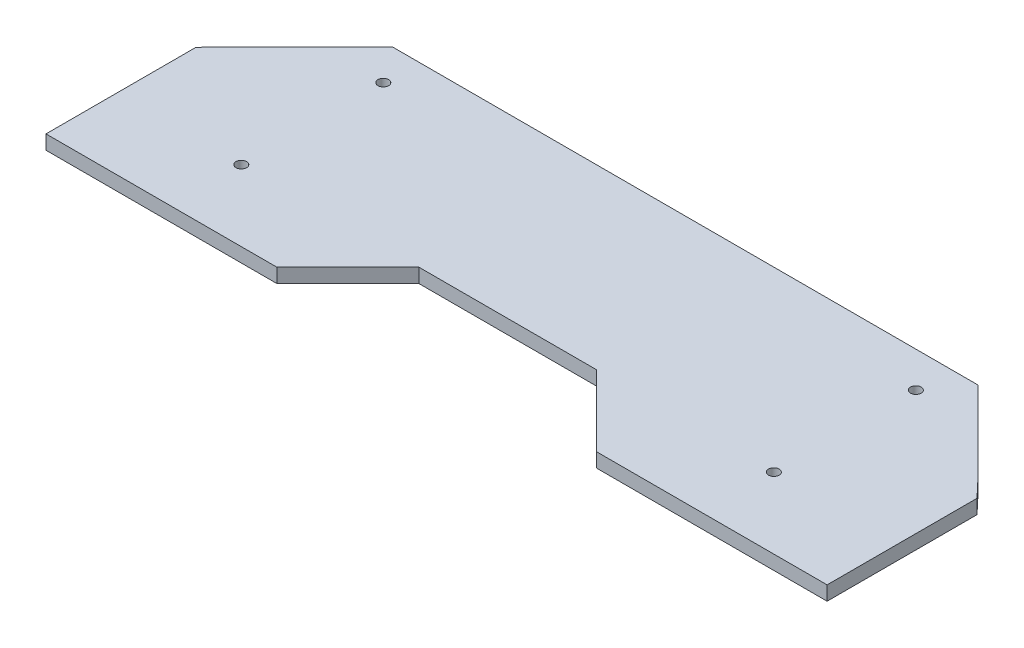
ISO-10303-21;
HEADER;
FILE_DESCRIPTION(('STEP AP214'),'2;1');
FILE_NAME('part.step','',(''),(''),'','','');
FILE_SCHEMA(('AUTOMOTIVE_DESIGN { 1 0 10303 214 1 1 1 1 }'));
ENDSEC;
DATA;
#1=APPLICATION_CONTEXT('core data for automotive mechanical design processes');
#2=APPLICATION_PROTOCOL_DEFINITION('international standard','automotive_design',2000,#1);
#3=PRODUCT_CONTEXT('',#1,'mechanical');
#4=PRODUCT('Part','Part','',(#3));
#5=PRODUCT_RELATED_PRODUCT_CATEGORY('part','',(#4));
#6=PRODUCT_DEFINITION_FORMATION('','',#4);
#7=PRODUCT_DEFINITION_CONTEXT('part definition',#1,'design');
#8=PRODUCT_DEFINITION('design','',#6,#7);
#9=PRODUCT_DEFINITION_SHAPE('','',#8);
#10=(LENGTH_UNIT() NAMED_UNIT(*) SI_UNIT(.MILLI.,.METRE.));
#11=(NAMED_UNIT(*) PLANE_ANGLE_UNIT() SI_UNIT($,.RADIAN.));
#12=(NAMED_UNIT(*) SI_UNIT($,.STERADIAN.) SOLID_ANGLE_UNIT());
#13=UNCERTAINTY_MEASURE_WITH_UNIT(LENGTH_MEASURE(1.E-05),#10,'distance_accuracy_value','');
#14=(GEOMETRIC_REPRESENTATION_CONTEXT(3) GLOBAL_UNCERTAINTY_ASSIGNED_CONTEXT((#13)) GLOBAL_UNIT_ASSIGNED_CONTEXT((#10,
#11,#12)) REPRESENTATION_CONTEXT('',''));
#15=CARTESIAN_POINT('',(0.,0.,0.));
#16=DIRECTION('',(0.,0.,1.));
#17=DIRECTION('',(1.,0.,0.));
#18=AXIS2_PLACEMENT_3D('',#15,#16,#17);
#19=CARTESIAN_POINT('',(-137.5,4.,35.));
#20=DIRECTION('',(0.,0.,-1.));
#21=DIRECTION('',(-1.,0.,0.));
#22=AXIS2_PLACEMENT_3D('',#19,#20,#21);
#23=PLANE('',#22);
#24=DIRECTION('',(1.,0.,0.));
#25=VECTOR('',#24,1.);
#26=CARTESIAN_POINT('',(-137.5,4.,35.));
#27=LINE('',#26,#25);
#28=CARTESIAN_POINT('',(-132.5,4.,35.));
#29=VERTEX_POINT('',#28);
#30=CARTESIAN_POINT('',(-67.4999999999999,4.,35.));
#31=VERTEX_POINT('',#30);
#32=EDGE_CURVE('E88',#29,#31,#27,.T.);
#33=ORIENTED_EDGE('',*,*,#32,.F.);
#34=DIRECTION('',(0.,1.,0.));
#35=VECTOR('',#34,1.);
#36=CARTESIAN_POINT('',(-132.5,-47.762432936357,35.));
#37=LINE('',#36,#35);
#38=CARTESIAN_POINT('',(-132.5,0.,35.));
#39=VERTEX_POINT('',#38);
#40=EDGE_CURVE('E177',#39,#29,#37,.T.);
#41=ORIENTED_EDGE('',*,*,#40,.F.);
#42=DIRECTION('',(1.,0.,0.));
#43=VECTOR('',#42,1.);
#44=CARTESIAN_POINT('',(-137.5,0.,35.));
#45=LINE('',#44,#43);
#46=CARTESIAN_POINT('',(-67.4999999999999,0.,35.));
#47=VERTEX_POINT('',#46);
#48=EDGE_CURVE('E221',#39,#47,#45,.T.);
#49=ORIENTED_EDGE('',*,*,#48,.T.);
#50=DIRECTION('',(0.,-1.,0.));
#51=VECTOR('',#50,1.);
#52=CARTESIAN_POINT('',(-67.4999999999999,4.,35.));
#53=LINE('',#52,#51);
#54=EDGE_CURVE('E11',#31,#47,#53,.T.);
#55=ORIENTED_EDGE('',*,*,#54,.F.);
#56=EDGE_LOOP('',(#33,#41,#49,#55));
#57=FACE_BOUND('',#56,.T.);
#58=ADVANCED_FACE('F37',(#57),#23,.F.);
#59=CARTESIAN_POINT('',(-67.4999999999999,4.,35.));
#60=DIRECTION('',(-0.70710678118655,0.,-0.707106781186545));
#61=DIRECTION('',(-0.707106781186545,0.,0.70710678118655));
#62=AXIS2_PLACEMENT_3D('',#59,#60,#61);
#63=PLANE('',#62);
#64=DIRECTION('',(0.707106781186545,0.,-0.70710678118655));
#65=VECTOR('',#64,1.);
#66=CARTESIAN_POINT('',(-67.4999999999999,0.,35.));
#67=LINE('',#66,#65);
#68=CARTESIAN_POINT('',(-47.5,0.,15.));
#69=VERTEX_POINT('',#68);
#70=EDGE_CURVE('E237',#47,#69,#67,.T.);
#71=ORIENTED_EDGE('',*,*,#70,.T.);
#72=DIRECTION('',(0.,-1.,0.));
#73=VECTOR('',#72,1.);
#74=CARTESIAN_POINT('',(-47.5,4.,15.));
#75=LINE('',#74,#73);
#76=CARTESIAN_POINT('',(-47.5,4.,15.));
#77=VERTEX_POINT('',#76);
#78=EDGE_CURVE('E44',#77,#69,#75,.T.);
#79=ORIENTED_EDGE('',*,*,#78,.F.);
#80=DIRECTION('',(0.707106781186545,0.,-0.70710678118655));
#81=VECTOR('',#80,1.);
#82=CARTESIAN_POINT('',(-67.4999999999999,4.,35.));
#83=LINE('',#82,#81);
#84=EDGE_CURVE('E225',#31,#77,#83,.T.);
#85=ORIENTED_EDGE('',*,*,#84,.F.);
#86=ORIENTED_EDGE('',*,*,#54,.T.);
#87=EDGE_LOOP('',(#71,#79,#85,#86));
#88=FACE_BOUND('',#87,.T.);
#89=ADVANCED_FACE('F270',(#88),#63,.F.);
#90=CARTESIAN_POINT('',(-47.5,4.,15.));
#91=DIRECTION('',(0.,0.,-1.));
#92=DIRECTION('',(-1.,0.,0.));
#93=AXIS2_PLACEMENT_3D('',#90,#91,#92);
#94=PLANE('',#93);
#95=DIRECTION('',(1.,0.,0.));
#96=VECTOR('',#95,1.);
#97=CARTESIAN_POINT('',(-47.5,0.,15.));
#98=LINE('',#97,#96);
#99=CARTESIAN_POINT('',(2.49999999999997,0.,15.));
#100=VERTEX_POINT('',#99);
#101=EDGE_CURVE('E239',#69,#100,#98,.T.);
#102=ORIENTED_EDGE('',*,*,#101,.T.);
#103=DIRECTION('',(0.,-1.,0.));
#104=VECTOR('',#103,1.);
#105=CARTESIAN_POINT('',(2.49999999999997,4.,15.));
#106=LINE('',#105,#104);
#107=CARTESIAN_POINT('',(2.49999999999997,4.,15.));
#108=VERTEX_POINT('',#107);
#109=EDGE_CURVE('E246',#108,#100,#106,.T.);
#110=ORIENTED_EDGE('',*,*,#109,.F.);
#111=DIRECTION('',(1.,0.,0.));
#112=VECTOR('',#111,1.);
#113=CARTESIAN_POINT('',(-47.5,4.,15.));
#114=LINE('',#113,#112);
#115=EDGE_CURVE('E228',#77,#108,#114,.T.);
#116=ORIENTED_EDGE('',*,*,#115,.F.);
#117=ORIENTED_EDGE('',*,*,#78,.T.);
#118=EDGE_LOOP('',(#102,#110,#116,#117));
#119=FACE_BOUND('',#118,.T.);
#120=ADVANCED_FACE('F252',(#119),#94,.F.);
#121=CARTESIAN_POINT('',(22.5,4.,35.));
#122=DIRECTION('',(0.707106781186546,0.,-0.707106781186549));
#123=DIRECTION('',(-0.707106781186549,0.,-0.707106781186546));
#124=AXIS2_PLACEMENT_3D('',#121,#122,#123);
#125=PLANE('',#124);
#126=DIRECTION('',(0.707106781186549,0.,0.707106781186546));
#127=VECTOR('',#126,1.);
#128=CARTESIAN_POINT('',(22.5,0.,35.));
#129=LINE('',#128,#127);
#130=CARTESIAN_POINT('',(22.5,0.,35.));
#131=VERTEX_POINT('',#130);
#132=EDGE_CURVE('E81',#100,#131,#129,.T.);
#133=ORIENTED_EDGE('',*,*,#132,.T.);
#134=DIRECTION('',(0.,-1.,0.));
#135=VECTOR('',#134,1.);
#136=CARTESIAN_POINT('',(22.5,4.,35.));
#137=LINE('',#136,#135);
#138=CARTESIAN_POINT('',(22.5,4.,35.));
#139=VERTEX_POINT('',#138);
#140=EDGE_CURVE('E235',#139,#131,#137,.T.);
#141=ORIENTED_EDGE('',*,*,#140,.F.);
#142=DIRECTION('',(0.707106781186549,0.,0.707106781186546));
#143=VECTOR('',#142,1.);
#144=CARTESIAN_POINT('',(22.5,4.,35.));
#145=LINE('',#144,#143);
#146=EDGE_CURVE('E60',#108,#139,#145,.T.);
#147=ORIENTED_EDGE('',*,*,#146,.F.);
#148=ORIENTED_EDGE('',*,*,#109,.T.);
#149=EDGE_LOOP('',(#133,#141,#147,#148));
#150=FACE_BOUND('',#149,.T.);
#151=ADVANCED_FACE('F260',(#150),#125,.F.);
#152=CARTESIAN_POINT('',(22.5,4.,35.));
#153=DIRECTION('',(0.,0.,-1.));
#154=DIRECTION('',(-1.,0.,0.));
#155=AXIS2_PLACEMENT_3D('',#152,#153,#154);
#156=PLANE('',#155);
#157=DIRECTION('',(1.,0.,0.));
#158=VECTOR('',#157,1.);
#159=CARTESIAN_POINT('',(22.5,0.,35.));
#160=LINE('',#159,#158);
#161=CARTESIAN_POINT('',(87.4999999999999,0.,34.9999999999999));
#162=VERTEX_POINT('',#161);
#163=EDGE_CURVE('E242',#131,#162,#160,.T.);
#164=ORIENTED_EDGE('',*,*,#163,.T.);
#165=DIRECTION('',(0.,1.,0.));
#166=VECTOR('',#165,1.);
#167=CARTESIAN_POINT('',(87.4999999999999,-47.762432936357,34.9999999999999));
#168=LINE('',#167,#166);
#169=CARTESIAN_POINT('',(87.4999999999999,4.,34.9999999999999));
#170=VERTEX_POINT('',#169);
#171=EDGE_CURVE('E146',#162,#170,#168,.T.);
#172=ORIENTED_EDGE('',*,*,#171,.T.);
#173=DIRECTION('',(1.,0.,0.));
#174=VECTOR('',#173,1.);
#175=CARTESIAN_POINT('',(22.5,4.,35.));
#176=LINE('',#175,#174);
#177=EDGE_CURVE('E231',#139,#170,#176,.T.);
#178=ORIENTED_EDGE('',*,*,#177,.F.);
#179=ORIENTED_EDGE('',*,*,#140,.T.);
#180=EDGE_LOOP('',(#164,#172,#178,#179));
#181=FACE_BOUND('',#180,.T.);
#182=ADVANCED_FACE('F258',(#181),#156,.F.);
#183=CARTESIAN_POINT('',(-117.5,4.,-35.));
#184=DIRECTION('',(0.,0.,1.));
#185=DIRECTION('',(1.,0.,0.));
#186=AXIS2_PLACEMENT_3D('',#183,#184,#185);
#187=PLANE('',#186);
#188=DIRECTION('',(-1.,0.,0.));
#189=VECTOR('',#188,1.);
#190=CARTESIAN_POINT('',(-117.5,4.,-35.));
#191=LINE('',#190,#189);
#192=CARTESIAN_POINT('',(60.,4.,-35.));
#193=VERTEX_POINT('',#192);
#194=CARTESIAN_POINT('',(-105.,4.,-35.));
#195=VERTEX_POINT('',#194);
#196=EDGE_CURVE('E233',#193,#195,#191,.T.);
#197=ORIENTED_EDGE('',*,*,#196,.F.);
#198=DIRECTION('',(0.,-1.,0.));
#199=VECTOR('',#198,1.);
#200=CARTESIAN_POINT('',(60.,4.,-35.));
#201=LINE('',#200,#199);
#202=CARTESIAN_POINT('',(60.,0.,-35.));
#203=VERTEX_POINT('',#202);
#204=EDGE_CURVE('E187',#193,#203,#201,.T.);
#205=ORIENTED_EDGE('',*,*,#204,.T.);
#206=DIRECTION('',(-1.,0.,0.));
#207=VECTOR('',#206,1.);
#208=CARTESIAN_POINT('',(-117.5,0.,-35.));
#209=LINE('',#208,#207);
#210=CARTESIAN_POINT('',(-105.,0.,-35.));
#211=VERTEX_POINT('',#210);
#212=EDGE_CURVE('E226',#203,#211,#209,.T.);
#213=ORIENTED_EDGE('',*,*,#212,.T.);
#214=DIRECTION('',(0.,1.,0.));
#215=VECTOR('',#214,1.);
#216=CARTESIAN_POINT('',(-105.,4.,-35.));
#217=LINE('',#216,#215);
#218=EDGE_CURVE('E196',#211,#195,#217,.T.);
#219=ORIENTED_EDGE('',*,*,#218,.T.);
#220=EDGE_LOOP('',(#197,#205,#213,#219));
#221=FACE_BOUND('',#220,.T.);
#222=ADVANCED_FACE('F268',(#221),#187,.F.);
#223=CARTESIAN_POINT('',(0.,4.,0.));
#224=DIRECTION('',(0.,-1.,0.));
#225=DIRECTION('',(0.,0.,-1.));
#226=AXIS2_PLACEMENT_3D('',#223,#224,#225);
#227=PLANE('',#226);
#228=CARTESIAN_POINT('',(-97.5,4.,-25.));
#229=DIRECTION('',(0.,1.,0.));
#230=DIRECTION('',(0.,0.,1.));
#231=AXIS2_PLACEMENT_3D('',#228,#229,#230);
#232=CIRCLE('',#231,1.5);
#233=CARTESIAN_POINT('',(-97.5,4.,-23.5));
#234=VERTEX_POINT('',#233);
#235=EDGE_CURVE('E204',#234,#234,#232,.T.);
#236=ORIENTED_EDGE('',*,*,#235,.F.);
#237=EDGE_LOOP('',(#236));
#238=FACE_BOUND('',#237,.T.);
#239=CARTESIAN_POINT('',(52.5000000000001,4.,-25.));
#240=DIRECTION('',(0.,1.,0.));
#241=DIRECTION('',(0.,0.,-1.));
#242=AXIS2_PLACEMENT_3D('',#239,#240,#241);
#243=CIRCLE('',#242,1.5);
#244=CARTESIAN_POINT('',(52.5000000000001,4.,-26.5));
#245=VERTEX_POINT('',#244);
#246=EDGE_CURVE('E210',#245,#245,#243,.T.);
#247=ORIENTED_EDGE('',*,*,#246,.F.);
#248=EDGE_LOOP('',(#247));
#249=FACE_BOUND('',#248,.T.);
#250=CARTESIAN_POINT('',(52.5000000000001,4.,15.));
#251=DIRECTION('',(0.,1.,0.));
#252=DIRECTION('',(0.,0.,-1.));
#253=AXIS2_PLACEMENT_3D('',#250,#251,#252);
#254=CIRCLE('',#253,1.5);
#255=CARTESIAN_POINT('',(52.5000000000001,4.,13.5));
#256=VERTEX_POINT('',#255);
#257=EDGE_CURVE('E199',#256,#256,#254,.T.);
#258=ORIENTED_EDGE('',*,*,#257,.F.);
#259=EDGE_LOOP('',(#258));
#260=FACE_BOUND('',#259,.T.);
#261=CARTESIAN_POINT('',(-97.5,4.,15.));
#262=DIRECTION('',(0.,1.,0.));
#263=DIRECTION('',(0.,0.,1.));
#264=AXIS2_PLACEMENT_3D('',#261,#262,#263);
#265=CIRCLE('',#264,1.5);
#266=CARTESIAN_POINT('',(-97.5,4.,16.5));
#267=VERTEX_POINT('',#266);
#268=EDGE_CURVE('E203',#267,#267,#265,.T.);
#269=ORIENTED_EDGE('',*,*,#268,.F.);
#270=EDGE_LOOP('',(#269));
#271=FACE_BOUND('',#270,.T.);
#272=ORIENTED_EDGE('',*,*,#177,.T.);
#273=DIRECTION('',(0.,0.,-1.));
#274=VECTOR('',#273,1.);
#275=CARTESIAN_POINT('',(87.4999999999999,4.,-7.21563436530775));
#276=LINE('',#275,#274);
#277=CARTESIAN_POINT('',(87.4999999999999,4.,-7.21563436530775));
#278=VERTEX_POINT('',#277);
#279=EDGE_CURVE('E160',#170,#278,#276,.T.);
#280=ORIENTED_EDGE('',*,*,#279,.T.);
#281=DIRECTION('',(-0.687292397126415,0.,-0.726380864872021));
#282=VECTOR('',#281,1.);
#283=CARTESIAN_POINT('',(82.4999999999999,4.,-12.5));
#284=LINE('',#283,#282);
#285=CARTESIAN_POINT('',(82.4999999999999,4.,-12.5));
#286=VERTEX_POINT('',#285);
#287=EDGE_CURVE('E152',#278,#286,#284,.T.);
#288=ORIENTED_EDGE('',*,*,#287,.T.);
#289=DIRECTION('',(0.707106781186549,0.,0.707106781186546));
#290=VECTOR('',#289,1.);
#291=CARTESIAN_POINT('',(82.5000000000001,4.,-12.5));
#292=LINE('',#291,#290);
#293=EDGE_CURVE('E180',#193,#286,#292,.T.);
#294=ORIENTED_EDGE('',*,*,#293,.F.);
#295=ORIENTED_EDGE('',*,*,#196,.T.);
#296=DIRECTION('',(0.707106781186546,0.,-0.707106781186549));
#297=VECTOR('',#296,1.);
#298=CARTESIAN_POINT('',(-127.5,4.,-12.5));
#299=LINE('',#298,#297);
#300=CARTESIAN_POINT('',(-127.5,4.,-12.5));
#301=VERTEX_POINT('',#300);
#302=EDGE_CURVE('E190',#301,#195,#299,.T.);
#303=ORIENTED_EDGE('',*,*,#302,.F.);
#304=DIRECTION('',(-0.687292397126415,0.,0.726380864872021));
#305=VECTOR('',#304,1.);
#306=CARTESIAN_POINT('',(-127.5,4.,-12.5));
#307=LINE('',#306,#305);
#308=CARTESIAN_POINT('',(-132.5,4.,-7.21563436530772));
#309=VERTEX_POINT('',#308);
#310=EDGE_CURVE('E165',#301,#309,#307,.T.);
#311=ORIENTED_EDGE('',*,*,#310,.T.);
#312=DIRECTION('',(0.,0.,1.));
#313=VECTOR('',#312,1.);
#314=CARTESIAN_POINT('',(-132.5,4.,-7.21563436530772));
#315=LINE('',#314,#313);
#316=EDGE_CURVE('E166',#309,#29,#315,.T.);
#317=ORIENTED_EDGE('',*,*,#316,.T.);
#318=ORIENTED_EDGE('',*,*,#32,.T.);
#319=ORIENTED_EDGE('',*,*,#84,.T.);
#320=ORIENTED_EDGE('',*,*,#115,.T.);
#321=ORIENTED_EDGE('',*,*,#146,.T.);
#322=EDGE_LOOP('',(#272,#280,#288,#294,#295,#303,#311,#317,#318,#319,#320,#321));
#323=FACE_BOUND('',#322,.T.);
#324=ADVANCED_FACE('F283',(#238,#249,#260,#271,#323),#227,.F.);
#325=CARTESIAN_POINT('',(0.,0.,0.));
#326=DIRECTION('',(0.,-1.,0.));
#327=DIRECTION('',(0.,0.,-1.));
#328=AXIS2_PLACEMENT_3D('',#325,#326,#327);
#329=PLANE('',#328);
#330=DIRECTION('',(0.707106781186549,0.,0.707106781186546));
#331=VECTOR('',#330,1.);
#332=CARTESIAN_POINT('',(82.5000000000001,0.,-12.5));
#333=LINE('',#332,#331);
#334=CARTESIAN_POINT('',(82.4999999999999,0.,-12.5));
#335=VERTEX_POINT('',#334);
#336=EDGE_CURVE('E143',#203,#335,#333,.T.);
#337=ORIENTED_EDGE('',*,*,#336,.T.);
#338=DIRECTION('',(-0.687292397126415,0.,-0.726380864872021));
#339=VECTOR('',#338,1.);
#340=CARTESIAN_POINT('',(82.4999999999999,0.,-12.5));
#341=LINE('',#340,#339);
#342=CARTESIAN_POINT('',(87.4999999999999,0.,-7.21563436530775));
#343=VERTEX_POINT('',#342);
#344=EDGE_CURVE('E134',#343,#335,#341,.T.);
#345=ORIENTED_EDGE('',*,*,#344,.F.);
#346=DIRECTION('',(0.,0.,-1.));
#347=VECTOR('',#346,1.);
#348=CARTESIAN_POINT('',(87.4999999999999,0.,-7.21563436530775));
#349=LINE('',#348,#347);
#350=EDGE_CURVE('E140',#162,#343,#349,.T.);
#351=ORIENTED_EDGE('',*,*,#350,.F.);
#352=ORIENTED_EDGE('',*,*,#163,.F.);
#353=ORIENTED_EDGE('',*,*,#132,.F.);
#354=ORIENTED_EDGE('',*,*,#101,.F.);
#355=ORIENTED_EDGE('',*,*,#70,.F.);
#356=ORIENTED_EDGE('',*,*,#48,.F.);
#357=DIRECTION('',(0.,0.,1.));
#358=VECTOR('',#357,1.);
#359=CARTESIAN_POINT('',(-132.5,0.,-7.21563436530772));
#360=LINE('',#359,#358);
#361=CARTESIAN_POINT('',(-132.5,0.,-7.21563436530772));
#362=VERTEX_POINT('',#361);
#363=EDGE_CURVE('E174',#362,#39,#360,.T.);
#364=ORIENTED_EDGE('',*,*,#363,.F.);
#365=DIRECTION('',(-0.687292397126415,0.,0.726380864872021));
#366=VECTOR('',#365,1.);
#367=CARTESIAN_POINT('',(-127.5,0.,-12.5));
#368=LINE('',#367,#366);
#369=CARTESIAN_POINT('',(-127.5,0.,-12.5));
#370=VERTEX_POINT('',#369);
#371=EDGE_CURVE('E168',#370,#362,#368,.T.);
#372=ORIENTED_EDGE('',*,*,#371,.F.);
#373=DIRECTION('',(0.707106781186546,0.,-0.707106781186549));
#374=VECTOR('',#373,1.);
#375=CARTESIAN_POINT('',(-127.5,0.,-12.5));
#376=LINE('',#375,#374);
#377=EDGE_CURVE('E51',#370,#211,#376,.T.);
#378=ORIENTED_EDGE('',*,*,#377,.T.);
#379=ORIENTED_EDGE('',*,*,#212,.F.);
#380=EDGE_LOOP('',(#337,#345,#351,#352,#353,#354,#355,#356,#364,#372,#378,#379));
#381=FACE_BOUND('',#380,.T.);
#382=CARTESIAN_POINT('',(-97.5,0.,-25.));
#383=DIRECTION('',(0.,1.,0.));
#384=DIRECTION('',(0.,0.,1.));
#385=AXIS2_PLACEMENT_3D('',#382,#383,#384);
#386=CIRCLE('',#385,1.5);
#387=CARTESIAN_POINT('',(-97.5,0.,-23.5));
#388=VERTEX_POINT('',#387);
#389=EDGE_CURVE('E200',#388,#388,#386,.T.);
#390=ORIENTED_EDGE('',*,*,#389,.T.);
#391=EDGE_LOOP('',(#390));
#392=FACE_BOUND('',#391,.T.);
#393=CARTESIAN_POINT('',(52.5000000000001,0.,-25.));
#394=DIRECTION('',(0.,1.,0.));
#395=DIRECTION('',(0.,0.,-1.));
#396=AXIS2_PLACEMENT_3D('',#393,#394,#395);
#397=CIRCLE('',#396,1.5);
#398=CARTESIAN_POINT('',(52.5000000000001,0.,-26.5));
#399=VERTEX_POINT('',#398);
#400=EDGE_CURVE('E207',#399,#399,#397,.T.);
#401=ORIENTED_EDGE('',*,*,#400,.T.);
#402=EDGE_LOOP('',(#401));
#403=FACE_BOUND('',#402,.T.);
#404=CARTESIAN_POINT('',(52.5000000000001,0.,15.));
#405=DIRECTION('',(0.,1.,0.));
#406=DIRECTION('',(0.,0.,-1.));
#407=AXIS2_PLACEMENT_3D('',#404,#405,#406);
#408=CIRCLE('',#407,1.5);
#409=CARTESIAN_POINT('',(52.5000000000001,0.,13.5));
#410=VERTEX_POINT('',#409);
#411=EDGE_CURVE('E213',#410,#410,#408,.T.);
#412=ORIENTED_EDGE('',*,*,#411,.T.);
#413=EDGE_LOOP('',(#412));
#414=FACE_BOUND('',#413,.T.);
#415=CARTESIAN_POINT('',(-97.5,0.,15.));
#416=DIRECTION('',(0.,1.,0.));
#417=DIRECTION('',(0.,0.,1.));
#418=AXIS2_PLACEMENT_3D('',#415,#416,#417);
#419=CIRCLE('',#418,1.5);
#420=CARTESIAN_POINT('',(-97.5,0.,16.5));
#421=VERTEX_POINT('',#420);
#422=EDGE_CURVE('E218',#421,#421,#419,.T.);
#423=ORIENTED_EDGE('',*,*,#422,.T.);
#424=EDGE_LOOP('',(#423));
#425=FACE_BOUND('',#424,.T.);
#426=ADVANCED_FACE('F136',(#381,#392,#403,#414,#425),#329,.T.);
#427=CARTESIAN_POINT('',(-97.5,0.,15.));
#428=DIRECTION('',(0.,1.,0.));
#429=DIRECTION('',(0.,0.,1.));
#430=AXIS2_PLACEMENT_3D('',#427,#428,#429);
#431=CYLINDRICAL_SURFACE('',#430,1.5);
#432=ORIENTED_EDGE('',*,*,#422,.F.);
#433=EDGE_LOOP('',(#432));
#434=FACE_BOUND('',#433,.T.);
#435=ORIENTED_EDGE('',*,*,#268,.T.);
#436=EDGE_LOOP('',(#435));
#437=FACE_BOUND('',#436,.T.);
#438=ADVANCED_FACE('F314',(#434,#437),#431,.F.);
#439=CARTESIAN_POINT('',(52.5000000000001,0.,15.));
#440=DIRECTION('',(0.,1.,0.));
#441=DIRECTION('',(0.,0.,1.));
#442=AXIS2_PLACEMENT_3D('',#439,#440,#441);
#443=CYLINDRICAL_SURFACE('',#442,1.5);
#444=ORIENTED_EDGE('',*,*,#411,.F.);
#445=EDGE_LOOP('',(#444));
#446=FACE_BOUND('',#445,.T.);
#447=ORIENTED_EDGE('',*,*,#257,.T.);
#448=EDGE_LOOP('',(#447));
#449=FACE_BOUND('',#448,.T.);
#450=ADVANCED_FACE('F310',(#446,#449),#443,.F.);
#451=CARTESIAN_POINT('',(52.5000000000001,0.,-25.));
#452=DIRECTION('',(0.,1.,0.));
#453=DIRECTION('',(0.,0.,1.));
#454=AXIS2_PLACEMENT_3D('',#451,#452,#453);
#455=CYLINDRICAL_SURFACE('',#454,1.5);
#456=ORIENTED_EDGE('',*,*,#400,.F.);
#457=EDGE_LOOP('',(#456));
#458=FACE_BOUND('',#457,.T.);
#459=ORIENTED_EDGE('',*,*,#246,.T.);
#460=EDGE_LOOP('',(#459));
#461=FACE_BOUND('',#460,.T.);
#462=ADVANCED_FACE('F303',(#458,#461),#455,.F.);
#463=CARTESIAN_POINT('',(-97.5,0.,-25.));
#464=DIRECTION('',(0.,1.,0.));
#465=DIRECTION('',(0.,0.,1.));
#466=AXIS2_PLACEMENT_3D('',#463,#464,#465);
#467=CYLINDRICAL_SURFACE('',#466,1.5);
#468=ORIENTED_EDGE('',*,*,#389,.F.);
#469=EDGE_LOOP('',(#468));
#470=FACE_BOUND('',#469,.T.);
#471=ORIENTED_EDGE('',*,*,#235,.T.);
#472=EDGE_LOOP('',(#471));
#473=FACE_BOUND('',#472,.T.);
#474=ADVANCED_FACE('F294',(#470,#473),#467,.F.);
#475=CARTESIAN_POINT('',(-127.5,0.,-12.5));
#476=DIRECTION('',(0.707106781186549,0.,0.707106781186546));
#477=DIRECTION('',(0.707106781186546,0.,-0.707106781186549));
#478=AXIS2_PLACEMENT_3D('',#475,#476,#477);
#479=PLANE('',#478);
#480=ORIENTED_EDGE('',*,*,#377,.F.);
#481=DIRECTION('',(0.,1.,0.));
#482=VECTOR('',#481,1.);
#483=CARTESIAN_POINT('',(-127.5,0.,-12.5));
#484=LINE('',#483,#482);
#485=EDGE_CURVE('E192',#370,#301,#484,.T.);
#486=ORIENTED_EDGE('',*,*,#485,.T.);
#487=ORIENTED_EDGE('',*,*,#302,.T.);
#488=ORIENTED_EDGE('',*,*,#218,.F.);
#489=EDGE_LOOP('',(#480,#486,#487,#488));
#490=FACE_BOUND('',#489,.T.);
#491=ADVANCED_FACE('F291',(#490),#479,.F.);
#492=CARTESIAN_POINT('',(82.5000000000001,0.,-12.5));
#493=DIRECTION('',(-0.707106781186546,0.,0.707106781186549));
#494=DIRECTION('',(0.707106781186549,0.,0.707106781186546));
#495=AXIS2_PLACEMENT_3D('',#492,#493,#494);
#496=PLANE('',#495);
#497=ORIENTED_EDGE('',*,*,#293,.T.);
#498=DIRECTION('',(0.,1.,0.));
#499=VECTOR('',#498,1.);
#500=CARTESIAN_POINT('',(82.5000000000001,0.,-12.5));
#501=LINE('',#500,#499);
#502=EDGE_CURVE('E183',#335,#286,#501,.T.);
#503=ORIENTED_EDGE('',*,*,#502,.F.);
#504=ORIENTED_EDGE('',*,*,#336,.F.);
#505=ORIENTED_EDGE('',*,*,#204,.F.);
#506=EDGE_LOOP('',(#497,#503,#504,#505));
#507=FACE_BOUND('',#506,.T.);
#508=ADVANCED_FACE('F293',(#507),#496,.F.);
#509=CARTESIAN_POINT('',(-127.5,-47.762432936357,-12.5));
#510=DIRECTION('',(-0.726380864872021,0.,-0.687292397126415));
#511=DIRECTION('',(-0.687292397126415,0.,0.726380864872021));
#512=AXIS2_PLACEMENT_3D('',#509,#510,#511);
#513=PLANE('',#512);
#514=ORIENTED_EDGE('',*,*,#485,.F.);
#515=ORIENTED_EDGE('',*,*,#371,.T.);
#516=DIRECTION('',(0.,1.,0.));
#517=VECTOR('',#516,1.);
#518=CARTESIAN_POINT('',(-132.5,-47.762432936357,-7.21563436530772));
#519=LINE('',#518,#517);
#520=EDGE_CURVE('E173',#362,#309,#519,.T.);
#521=ORIENTED_EDGE('',*,*,#520,.T.);
#522=ORIENTED_EDGE('',*,*,#310,.F.);
#523=EDGE_LOOP('',(#514,#515,#521,#522));
#524=FACE_BOUND('',#523,.T.);
#525=ADVANCED_FACE('F288',(#524),#513,.T.);
#526=CARTESIAN_POINT('',(-132.5,-47.762432936357,-7.21563436530772));
#527=DIRECTION('',(-1.,0.,0.));
#528=DIRECTION('',(0.,0.,1.));
#529=AXIS2_PLACEMENT_3D('',#526,#527,#528);
#530=PLANE('',#529);
#531=ORIENTED_EDGE('',*,*,#520,.F.);
#532=ORIENTED_EDGE('',*,*,#363,.T.);
#533=ORIENTED_EDGE('',*,*,#40,.T.);
#534=ORIENTED_EDGE('',*,*,#316,.F.);
#535=EDGE_LOOP('',(#531,#532,#533,#534));
#536=FACE_BOUND('',#535,.T.);
#537=ADVANCED_FACE('F282',(#536),#530,.T.);
#538=CARTESIAN_POINT('',(87.4999999999999,-47.762432936357,-7.21563436530775));
#539=DIRECTION('',(1.,0.,0.));
#540=DIRECTION('',(0.,0.,-1.));
#541=AXIS2_PLACEMENT_3D('',#538,#539,#540);
#542=PLANE('',#541);
#543=ORIENTED_EDGE('',*,*,#171,.F.);
#544=ORIENTED_EDGE('',*,*,#350,.T.);
#545=DIRECTION('',(0.,1.,0.));
#546=VECTOR('',#545,1.);
#547=CARTESIAN_POINT('',(87.4999999999999,-47.762432936357,-7.21563436530775));
#548=LINE('',#547,#546);
#549=EDGE_CURVE('E147',#343,#278,#548,.T.);
#550=ORIENTED_EDGE('',*,*,#549,.T.);
#551=ORIENTED_EDGE('',*,*,#279,.F.);
#552=EDGE_LOOP('',(#543,#544,#550,#551));
#553=FACE_BOUND('',#552,.T.);
#554=ADVANCED_FACE('F157',(#553),#542,.T.);
#555=CARTESIAN_POINT('',(82.4999999999999,-47.762432936357,-12.5));
#556=DIRECTION('',(0.726380864872021,0.,-0.687292397126415));
#557=DIRECTION('',(-0.687292397126415,0.,-0.726380864872021));
#558=AXIS2_PLACEMENT_3D('',#555,#556,#557);
#559=PLANE('',#558);
#560=ORIENTED_EDGE('',*,*,#549,.F.);
#561=ORIENTED_EDGE('',*,*,#344,.T.);
#562=ORIENTED_EDGE('',*,*,#502,.T.);
#563=ORIENTED_EDGE('',*,*,#287,.F.);
#564=EDGE_LOOP('',(#560,#561,#562,#563));
#565=FACE_BOUND('',#564,.T.);
#566=ADVANCED_FACE('F150',(#565),#559,.T.);
#567=CLOSED_SHELL('',(#58,#89,#120,#151,#182,#222,#324,#426,#438,#450,#462,#474,#491,#508,#525,
#537,#554,#566));
#568=MANIFOLD_SOLID_BREP('B2',#567);
#569=ADVANCED_BREP_SHAPE_REPRESENTATION('',(#18,#568),#14);
#570=SHAPE_DEFINITION_REPRESENTATION(#9,#569);
ENDSEC;
END-ISO-10303-21;
